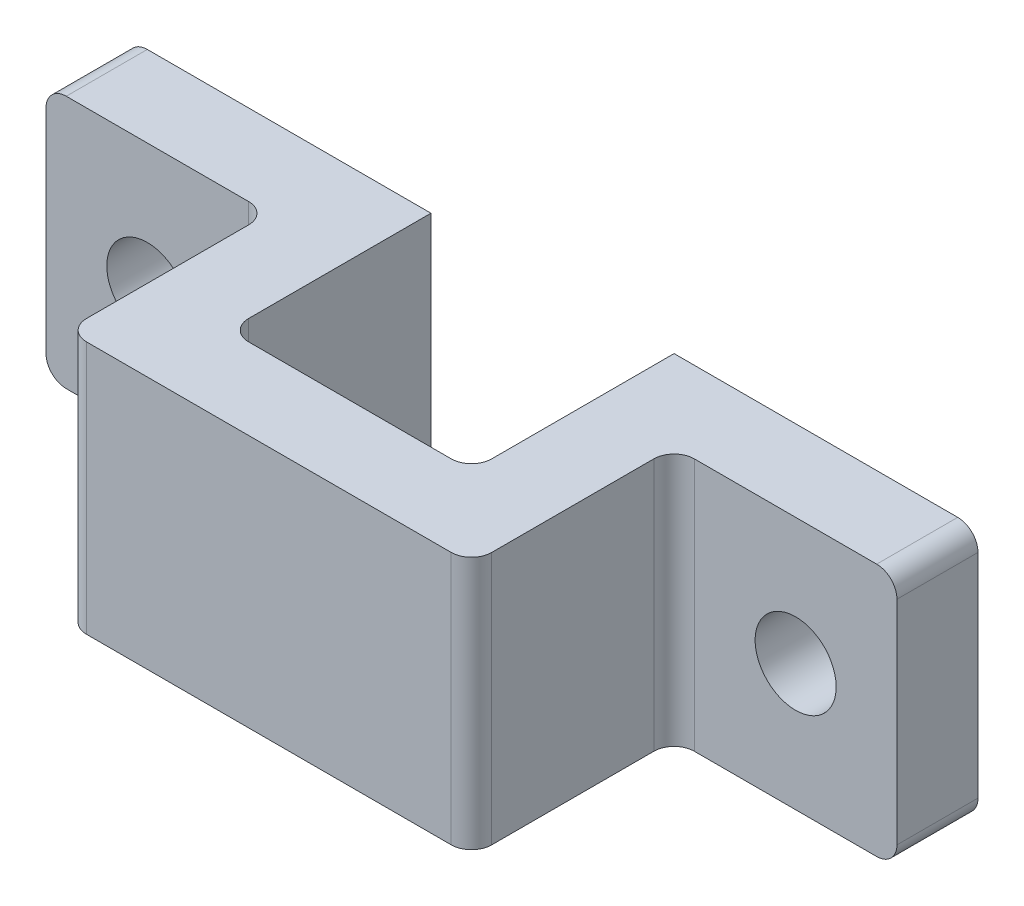
ISO-10303-21;
HEADER;
FILE_DESCRIPTION(('STEP AP214'),'2;1');
FILE_NAME('part.step','',(''),(''),'','','');
FILE_SCHEMA(('AUTOMOTIVE_DESIGN { 1 0 10303 214 1 1 1 1 }'));
ENDSEC;
DATA;
#1=APPLICATION_CONTEXT('core data for automotive mechanical design processes');
#2=APPLICATION_PROTOCOL_DEFINITION('international standard','automotive_design',2000,#1);
#3=PRODUCT_CONTEXT('',#1,'mechanical');
#4=PRODUCT('Part','Part','',(#3));
#5=PRODUCT_RELATED_PRODUCT_CATEGORY('part','',(#4));
#6=PRODUCT_DEFINITION_FORMATION('','',#4);
#7=PRODUCT_DEFINITION_CONTEXT('part definition',#1,'design');
#8=PRODUCT_DEFINITION('design','',#6,#7);
#9=PRODUCT_DEFINITION_SHAPE('','',#8);
#10=(LENGTH_UNIT() NAMED_UNIT(*) SI_UNIT(.MILLI.,.METRE.));
#11=(NAMED_UNIT(*) PLANE_ANGLE_UNIT() SI_UNIT($,.RADIAN.));
#12=(NAMED_UNIT(*) SI_UNIT($,.STERADIAN.) SOLID_ANGLE_UNIT());
#13=UNCERTAINTY_MEASURE_WITH_UNIT(LENGTH_MEASURE(1.E-05),#10,'distance_accuracy_value','');
#14=(GEOMETRIC_REPRESENTATION_CONTEXT(3) GLOBAL_UNCERTAINTY_ASSIGNED_CONTEXT((#13)) GLOBAL_UNIT_ASSIGNED_CONTEXT((#10,
#11,#12)) REPRESENTATION_CONTEXT('',''));
#15=CARTESIAN_POINT('',(0.,0.,0.));
#16=DIRECTION('',(0.,0.,1.));
#17=DIRECTION('',(1.,0.,0.));
#18=AXIS2_PLACEMENT_3D('',#15,#16,#17);
#19=CARTESIAN_POINT('',(0.,0.,0.));
#20=DIRECTION('',(0.,0.,1.));
#21=DIRECTION('',(1.,0.,0.));
#22=AXIS2_PLACEMENT_3D('',#19,#20,#21);
#23=PLANE('',#22);
#24=CARTESIAN_POINT('',(-16.,0.,0.));
#25=DIRECTION('',(0.,0.,1.));
#26=DIRECTION('',(-1.,0.,0.));
#27=AXIS2_PLACEMENT_3D('',#24,#25,#26);
#28=CIRCLE('',#27,2.);
#29=CARTESIAN_POINT('',(-14.,0.,0.));
#30=VERTEX_POINT('',#29);
#31=EDGE_CURVE('E426',#30,#30,#28,.T.);
#32=ORIENTED_EDGE('',*,*,#31,.T.);
#33=EDGE_LOOP('',(#32));
#34=FACE_BOUND('',#33,.T.);
#35=CARTESIAN_POINT('',(-20.,5.25,0.));
#36=DIRECTION('',(0.,0.,1.));
#37=DIRECTION('',(-0.707106781186548,0.707106781186548,0.));
#38=AXIS2_PLACEMENT_3D('',#35,#36,#37);
#39=CIRCLE('',#38,1.);
#40=CARTESIAN_POINT('',(-20.,6.25,0.));
#41=VERTEX_POINT('',#40);
#42=CARTESIAN_POINT('',(-21.,5.25,0.));
#43=VERTEX_POINT('',#42);
#44=EDGE_CURVE('E460',#41,#43,#39,.T.);
#45=ORIENTED_EDGE('',*,*,#44,.F.);
#46=DIRECTION('',(1.,0.,0.));
#47=VECTOR('',#46,1.);
#48=CARTESIAN_POINT('',(-21.,6.25,0.));
#49=LINE('',#48,#47);
#50=CARTESIAN_POINT('',(-6.,6.25,0.));
#51=VERTEX_POINT('',#50);
#52=EDGE_CURVE('E350',#41,#51,#49,.T.);
#53=ORIENTED_EDGE('',*,*,#52,.T.);
#54=DIRECTION('',(0.,-1.,0.));
#55=VECTOR('',#54,1.);
#56=CARTESIAN_POINT('',(-6.,-3.125,0.));
#57=LINE('',#56,#55);
#58=CARTESIAN_POINT('',(-6.,-6.25,0.));
#59=VERTEX_POINT('',#58);
#60=EDGE_CURVE('E320',#51,#59,#57,.T.);
#61=ORIENTED_EDGE('',*,*,#60,.T.);
#62=DIRECTION('',(-1.,0.,0.));
#63=VECTOR('',#62,1.);
#64=CARTESIAN_POINT('',(21.,-6.25,0.));
#65=LINE('',#64,#63);
#66=CARTESIAN_POINT('',(-20.,-6.25,0.));
#67=VERTEX_POINT('',#66);
#68=EDGE_CURVE('E484',#59,#67,#65,.T.);
#69=ORIENTED_EDGE('',*,*,#68,.T.);
#70=CARTESIAN_POINT('',(-20.,-5.25,0.));
#71=DIRECTION('',(0.,0.,1.));
#72=DIRECTION('',(-0.707106781186548,-0.707106781186548,0.));
#73=AXIS2_PLACEMENT_3D('',#70,#71,#72);
#74=CIRCLE('',#73,1.);
#75=CARTESIAN_POINT('',(-21.,-5.25,0.));
#76=VERTEX_POINT('',#75);
#77=EDGE_CURVE('E329',#76,#67,#74,.T.);
#78=ORIENTED_EDGE('',*,*,#77,.F.);
#79=DIRECTION('',(0.,1.,0.));
#80=VECTOR('',#79,1.);
#81=CARTESIAN_POINT('',(-21.,-6.25,0.));
#82=LINE('',#81,#80);
#83=EDGE_CURVE('E12',#76,#43,#82,.T.);
#84=ORIENTED_EDGE('',*,*,#83,.T.);
#85=EDGE_LOOP('',(#45,#53,#61,#69,#78,#84));
#86=FACE_BOUND('',#85,.T.);
#87=ADVANCED_FACE('F19',(#34,#86),#23,.F.);
#88=CARTESIAN_POINT('',(-21.,6.25,0.));
#89=DIRECTION('',(-1.,0.,0.));
#90=DIRECTION('',(0.,0.,1.));
#91=AXIS2_PLACEMENT_3D('',#88,#89,#90);
#92=PLANE('',#91);
#93=DIRECTION('',(0.,0.,1.));
#94=VECTOR('',#93,1.);
#95=CARTESIAN_POINT('',(-21.,5.25,0.));
#96=LINE('',#95,#94);
#97=CARTESIAN_POINT('',(-21.,5.25,4.));
#98=VERTEX_POINT('',#97);
#99=EDGE_CURVE('E466',#43,#98,#96,.T.);
#100=ORIENTED_EDGE('',*,*,#99,.F.);
#101=ORIENTED_EDGE('',*,*,#83,.F.);
#102=DIRECTION('',(0.,0.,-1.));
#103=VECTOR('',#102,1.);
#104=CARTESIAN_POINT('',(-21.,-5.25,0.));
#105=LINE('',#104,#103);
#106=CARTESIAN_POINT('',(-21.,-5.25,4.));
#107=VERTEX_POINT('',#106);
#108=EDGE_CURVE('E325',#107,#76,#105,.T.);
#109=ORIENTED_EDGE('',*,*,#108,.F.);
#110=DIRECTION('',(0.,-1.,0.));
#111=VECTOR('',#110,1.);
#112=CARTESIAN_POINT('',(-21.,-6.25,4.));
#113=LINE('',#112,#111);
#114=EDGE_CURVE('E476',#98,#107,#113,.T.);
#115=ORIENTED_EDGE('',*,*,#114,.F.);
#116=EDGE_LOOP('',(#100,#101,#109,#115));
#117=FACE_BOUND('',#116,.T.);
#118=ADVANCED_FACE('F703',(#117),#92,.T.);
#119=CARTESIAN_POINT('',(21.,-6.25,0.));
#120=DIRECTION('',(1.,0.,0.));
#121=DIRECTION('',(0.,1.,0.));
#122=AXIS2_PLACEMENT_3D('',#119,#120,#121);
#123=PLANE('',#122);
#124=DIRECTION('',(0.,0.,-1.));
#125=VECTOR('',#124,1.);
#126=CARTESIAN_POINT('',(21.,5.25,0.));
#127=LINE('',#126,#125);
#128=CARTESIAN_POINT('',(21.,5.25,4.));
#129=VERTEX_POINT('',#128);
#130=CARTESIAN_POINT('',(21.,5.25,0.));
#131=VERTEX_POINT('',#130);
#132=EDGE_CURVE('E291',#129,#131,#127,.T.);
#133=ORIENTED_EDGE('',*,*,#132,.F.);
#134=DIRECTION('',(0.,1.,0.));
#135=VECTOR('',#134,1.);
#136=CARTESIAN_POINT('',(21.,6.25,4.));
#137=LINE('',#136,#135);
#138=CARTESIAN_POINT('',(21.,-5.25,4.));
#139=VERTEX_POINT('',#138);
#140=EDGE_CURVE('E30',#139,#129,#137,.T.);
#141=ORIENTED_EDGE('',*,*,#140,.F.);
#142=DIRECTION('',(0.,0.,1.));
#143=VECTOR('',#142,1.);
#144=CARTESIAN_POINT('',(21.,-5.25,0.));
#145=LINE('',#144,#143);
#146=CARTESIAN_POINT('',(21.,-5.25,0.));
#147=VERTEX_POINT('',#146);
#148=EDGE_CURVE('E23',#147,#139,#145,.T.);
#149=ORIENTED_EDGE('',*,*,#148,.F.);
#150=DIRECTION('',(0.,-1.,0.));
#151=VECTOR('',#150,1.);
#152=CARTESIAN_POINT('',(21.,6.25,0.));
#153=LINE('',#152,#151);
#154=EDGE_CURVE('E212',#131,#147,#153,.T.);
#155=ORIENTED_EDGE('',*,*,#154,.F.);
#156=EDGE_LOOP('',(#133,#141,#149,#155));
#157=FACE_BOUND('',#156,.T.);
#158=ADVANCED_FACE('F725',(#157),#123,.T.);
#159=CARTESIAN_POINT('',(0.,0.,4.));
#160=DIRECTION('',(0.,0.,1.));
#161=DIRECTION('',(1.,0.,0.));
#162=AXIS2_PLACEMENT_3D('',#159,#160,#161);
#163=PLANE('',#162);
#164=CARTESIAN_POINT('',(16.0000003129244,0.,4.));
#165=DIRECTION('',(0.,0.,-1.));
#166=DIRECTION('',(-1.,0.,0.));
#167=AXIS2_PLACEMENT_3D('',#164,#165,#166);
#168=CIRCLE('',#167,2.);
#169=CARTESIAN_POINT('',(18.0000003129244,0.,4.));
#170=VERTEX_POINT('',#169);
#171=EDGE_CURVE('E315',#170,#170,#168,.T.);
#172=ORIENTED_EDGE('',*,*,#171,.T.);
#173=EDGE_LOOP('',(#172));
#174=FACE_BOUND('',#173,.T.);
#175=CARTESIAN_POINT('',(20.,5.25,4.));
#176=DIRECTION('',(0.,0.,-1.));
#177=DIRECTION('',(0.707106781186548,0.707106781186548,0.));
#178=AXIS2_PLACEMENT_3D('',#175,#176,#177);
#179=CIRCLE('',#178,1.);
#180=CARTESIAN_POINT('',(20.,6.25,4.));
#181=VERTEX_POINT('',#180);
#182=EDGE_CURVE('E210',#181,#129,#179,.T.);
#183=ORIENTED_EDGE('',*,*,#182,.F.);
#184=DIRECTION('',(-1.,0.,0.));
#185=VECTOR('',#184,1.);
#186=CARTESIAN_POINT('',(-21.,6.25,4.));
#187=LINE('',#186,#185);
#188=CARTESIAN_POINT('',(11.,6.25,4.));
#189=VERTEX_POINT('',#188);
#190=EDGE_CURVE('E151',#181,#189,#187,.T.);
#191=ORIENTED_EDGE('',*,*,#190,.T.);
#192=DIRECTION('',(0.,1.,0.));
#193=VECTOR('',#192,1.);
#194=CARTESIAN_POINT('',(11.,-3.125,4.));
#195=LINE('',#194,#193);
#196=CARTESIAN_POINT('',(11.,-6.25,4.));
#197=VERTEX_POINT('',#196);
#198=EDGE_CURVE('E194',#197,#189,#195,.T.);
#199=ORIENTED_EDGE('',*,*,#198,.F.);
#200=DIRECTION('',(1.,0.,0.));
#201=VECTOR('',#200,1.);
#202=CARTESIAN_POINT('',(21.,-6.25,4.));
#203=LINE('',#202,#201);
#204=CARTESIAN_POINT('',(20.,-6.25,4.));
#205=VERTEX_POINT('',#204);
#206=EDGE_CURVE('E259',#197,#205,#203,.T.);
#207=ORIENTED_EDGE('',*,*,#206,.T.);
#208=CARTESIAN_POINT('',(20.,-5.25,4.));
#209=DIRECTION('',(0.,0.,-1.));
#210=DIRECTION('',(0.707106781186548,-0.707106781186548,0.));
#211=AXIS2_PLACEMENT_3D('',#208,#209,#210);
#212=CIRCLE('',#211,1.);
#213=EDGE_CURVE('E379',#139,#205,#212,.T.);
#214=ORIENTED_EDGE('',*,*,#213,.F.);
#215=ORIENTED_EDGE('',*,*,#140,.T.);
#216=EDGE_LOOP('',(#183,#191,#199,#207,#214,#215));
#217=FACE_BOUND('',#216,.T.);
#218=ADVANCED_FACE('F208',(#174,#217),#163,.T.);
#219=CARTESIAN_POINT('',(-5.,-6.25,9.));
#220=DIRECTION('',(0.,1.,0.));
#221=DIRECTION('',(0.,0.,1.));
#222=AXIS2_PLACEMENT_3D('',#219,#220,#221);
#223=CYLINDRICAL_SURFACE('',#222,1.);
#224=CARTESIAN_POINT('',(-5.,6.25,9.));
#225=DIRECTION('',(0.,-1.,0.));
#226=DIRECTION('',(0.,0.,1.));
#227=AXIS2_PLACEMENT_3D('',#224,#225,#226);
#228=CIRCLE('',#227,1.);
#229=CARTESIAN_POINT('',(-5.,6.25,10.));
#230=VERTEX_POINT('',#229);
#231=CARTESIAN_POINT('',(-6.,6.25,9.));
#232=VERTEX_POINT('',#231);
#233=EDGE_CURVE('E285',#230,#232,#228,.T.);
#234=ORIENTED_EDGE('',*,*,#233,.F.);
#235=DIRECTION('',(0.,1.,0.));
#236=VECTOR('',#235,1.);
#237=CARTESIAN_POINT('',(-5.,-6.25,10.));
#238=LINE('',#237,#236);
#239=CARTESIAN_POINT('',(-5.,-6.25,10.));
#240=VERTEX_POINT('',#239);
#241=EDGE_CURVE('E264',#240,#230,#238,.T.);
#242=ORIENTED_EDGE('',*,*,#241,.F.);
#243=CARTESIAN_POINT('',(-5.,-6.25,9.));
#244=DIRECTION('',(0.,1.,0.));
#245=DIRECTION('',(0.,0.,1.));
#246=AXIS2_PLACEMENT_3D('',#243,#244,#245);
#247=CIRCLE('',#246,1.);
#248=CARTESIAN_POINT('',(-6.,-6.25,9.));
#249=VERTEX_POINT('',#248);
#250=EDGE_CURVE('E483',#249,#240,#247,.T.);
#251=ORIENTED_EDGE('',*,*,#250,.F.);
#252=DIRECTION('',(0.,1.,0.));
#253=VECTOR('',#252,1.);
#254=CARTESIAN_POINT('',(-6.,-6.25,9.));
#255=LINE('',#254,#253);
#256=EDGE_CURVE('E316',#249,#232,#255,.T.);
#257=ORIENTED_EDGE('',*,*,#256,.T.);
#258=EDGE_LOOP('',(#234,#242,#251,#257));
#259=FACE_BOUND('',#258,.T.);
#260=ADVANCED_FACE('F728',(#259),#223,.F.);
#261=CARTESIAN_POINT('',(-5.,-6.25,10.));
#262=DIRECTION('',(0.,0.,1.));
#263=DIRECTION('',(1.,0.,0.));
#264=AXIS2_PLACEMENT_3D('',#261,#262,#263);
#265=PLANE('',#264);
#266=DIRECTION('',(-1.,0.,0.));
#267=VECTOR('',#266,1.);
#268=CARTESIAN_POINT('',(8.,6.25,10.));
#269=LINE('',#268,#267);
#270=CARTESIAN_POINT('',(5.,6.25,10.));
#271=VERTEX_POINT('',#270);
#272=EDGE_CURVE('E290',#271,#230,#269,.T.);
#273=ORIENTED_EDGE('',*,*,#272,.F.);
#274=DIRECTION('',(0.,1.,0.));
#275=VECTOR('',#274,1.);
#276=CARTESIAN_POINT('',(5.,-6.25,10.));
#277=LINE('',#276,#275);
#278=CARTESIAN_POINT('',(5.,-6.25,10.));
#279=VERTEX_POINT('',#278);
#280=EDGE_CURVE('E399',#279,#271,#277,.T.);
#281=ORIENTED_EDGE('',*,*,#280,.F.);
#282=DIRECTION('',(1.,0.,0.));
#283=VECTOR('',#282,1.);
#284=CARTESIAN_POINT('',(-13.,-6.25,10.));
#285=LINE('',#284,#283);
#286=EDGE_CURVE('E251',#240,#279,#285,.T.);
#287=ORIENTED_EDGE('',*,*,#286,.F.);
#288=ORIENTED_EDGE('',*,*,#241,.T.);
#289=EDGE_LOOP('',(#273,#281,#287,#288));
#290=FACE_BOUND('',#289,.T.);
#291=ADVANCED_FACE('F731',(#290),#265,.F.);
#292=CARTESIAN_POINT('',(5.,-6.25,9.));
#293=DIRECTION('',(0.,1.,0.));
#294=DIRECTION('',(1.,0.,0.));
#295=AXIS2_PLACEMENT_3D('',#292,#293,#294);
#296=CYLINDRICAL_SURFACE('',#295,1.);
#297=CARTESIAN_POINT('',(5.,6.25,9.));
#298=DIRECTION('',(0.,-1.,0.));
#299=DIRECTION('',(1.,0.,0.));
#300=AXIS2_PLACEMENT_3D('',#297,#298,#299);
#301=CIRCLE('',#300,1.);
#302=CARTESIAN_POINT('',(6.,6.25,9.));
#303=VERTEX_POINT('',#302);
#304=EDGE_CURVE('E302',#303,#271,#301,.T.);
#305=ORIENTED_EDGE('',*,*,#304,.F.);
#306=DIRECTION('',(0.,1.,0.));
#307=VECTOR('',#306,1.);
#308=CARTESIAN_POINT('',(6.,-6.25,9.));
#309=LINE('',#308,#307);
#310=CARTESIAN_POINT('',(6.,-6.25,9.));
#311=VERTEX_POINT('',#310);
#312=EDGE_CURVE('E271',#311,#303,#309,.T.);
#313=ORIENTED_EDGE('',*,*,#312,.F.);
#314=CARTESIAN_POINT('',(5.,-6.25,9.));
#315=DIRECTION('',(0.,1.,0.));
#316=DIRECTION('',(1.,0.,0.));
#317=AXIS2_PLACEMENT_3D('',#314,#315,#316);
#318=CIRCLE('',#317,1.);
#319=EDGE_CURVE('E247',#279,#311,#318,.T.);
#320=ORIENTED_EDGE('',*,*,#319,.F.);
#321=ORIENTED_EDGE('',*,*,#280,.T.);
#322=EDGE_LOOP('',(#305,#313,#320,#321));
#323=FACE_BOUND('',#322,.T.);
#324=ADVANCED_FACE('F770',(#323),#296,.F.);
#325=CARTESIAN_POINT('',(6.,-6.25,9.));
#326=DIRECTION('',(1.,0.,0.));
#327=DIRECTION('',(0.,1.,0.));
#328=AXIS2_PLACEMENT_3D('',#325,#326,#327);
#329=PLANE('',#328);
#330=DIRECTION('',(0.,0.,1.));
#331=VECTOR('',#330,1.);
#332=CARTESIAN_POINT('',(6.,6.25,4.5));
#333=LINE('',#332,#331);
#334=CARTESIAN_POINT('',(6.,6.25,0.));
#335=VERTEX_POINT('',#334);
#336=EDGE_CURVE('E228',#335,#303,#333,.T.);
#337=ORIENTED_EDGE('',*,*,#336,.F.);
#338=DIRECTION('',(0.,1.,0.));
#339=VECTOR('',#338,1.);
#340=CARTESIAN_POINT('',(6.,-3.125,0.));
#341=LINE('',#340,#339);
#342=CARTESIAN_POINT('',(6.,-6.25,0.));
#343=VERTEX_POINT('',#342);
#344=EDGE_CURVE('E419',#343,#335,#341,.T.);
#345=ORIENTED_EDGE('',*,*,#344,.F.);
#346=DIRECTION('',(0.,0.,-1.));
#347=VECTOR('',#346,1.);
#348=CARTESIAN_POINT('',(6.,-6.25,4.5));
#349=LINE('',#348,#347);
#350=EDGE_CURVE('E250',#311,#343,#349,.T.);
#351=ORIENTED_EDGE('',*,*,#350,.F.);
#352=ORIENTED_EDGE('',*,*,#312,.T.);
#353=EDGE_LOOP('',(#337,#345,#351,#352));
#354=FACE_BOUND('',#353,.T.);
#355=ADVANCED_FACE('F757',(#354),#329,.F.);
#356=CARTESIAN_POINT('',(-6.,-6.25,0.));
#357=DIRECTION('',(-1.,0.,0.));
#358=DIRECTION('',(0.,0.,1.));
#359=AXIS2_PLACEMENT_3D('',#356,#357,#358);
#360=PLANE('',#359);
#361=DIRECTION('',(0.,0.,-1.));
#362=VECTOR('',#361,1.);
#363=CARTESIAN_POINT('',(-6.,6.25,0.));
#364=LINE('',#363,#362);
#365=EDGE_CURVE('E244',#232,#51,#364,.T.);
#366=ORIENTED_EDGE('',*,*,#365,.F.);
#367=ORIENTED_EDGE('',*,*,#256,.F.);
#368=DIRECTION('',(0.,0.,1.));
#369=VECTOR('',#368,1.);
#370=CARTESIAN_POINT('',(-6.,-6.25,0.));
#371=LINE('',#370,#369);
#372=EDGE_CURVE('E480',#59,#249,#371,.T.);
#373=ORIENTED_EDGE('',*,*,#372,.F.);
#374=ORIENTED_EDGE('',*,*,#60,.F.);
#375=EDGE_LOOP('',(#366,#367,#373,#374));
#376=FACE_BOUND('',#375,.T.);
#377=ADVANCED_FACE('F754',(#376),#360,.F.);
#378=CARTESIAN_POINT('',(0.,0.,14.));
#379=DIRECTION('',(0.,0.,1.));
#380=DIRECTION('',(1.,0.,0.));
#381=AXIS2_PLACEMENT_3D('',#378,#379,#380);
#382=PLANE('',#381);
#383=DIRECTION('',(0.,-1.,0.));
#384=VECTOR('',#383,1.);
#385=CARTESIAN_POINT('',(9.,-3.125,14.));
#386=LINE('',#385,#384);
#387=CARTESIAN_POINT('',(9.,6.25,14.));
#388=VERTEX_POINT('',#387);
#389=CARTESIAN_POINT('',(9.,-6.25,14.));
#390=VERTEX_POINT('',#389);
#391=EDGE_CURVE('E265',#388,#390,#386,.T.);
#392=ORIENTED_EDGE('',*,*,#391,.F.);
#393=DIRECTION('',(-1.,0.,0.));
#394=VECTOR('',#393,1.);
#395=CARTESIAN_POINT('',(-10.,6.25,14.));
#396=LINE('',#395,#394);
#397=CARTESIAN_POINT('',(-9.,6.25,14.));
#398=VERTEX_POINT('',#397);
#399=EDGE_CURVE('E243',#388,#398,#396,.T.);
#400=ORIENTED_EDGE('',*,*,#399,.T.);
#401=DIRECTION('',(0.,1.,0.));
#402=VECTOR('',#401,1.);
#403=CARTESIAN_POINT('',(-9.,3.125,14.));
#404=LINE('',#403,#402);
#405=CARTESIAN_POINT('',(-9.,-6.25,14.));
#406=VERTEX_POINT('',#405);
#407=EDGE_CURVE('E321',#406,#398,#404,.T.);
#408=ORIENTED_EDGE('',*,*,#407,.F.);
#409=DIRECTION('',(1.,0.,0.));
#410=VECTOR('',#409,1.);
#411=CARTESIAN_POINT('',(10.,-6.25,14.));
#412=LINE('',#411,#410);
#413=EDGE_CURVE('E253',#406,#390,#412,.T.);
#414=ORIENTED_EDGE('',*,*,#413,.T.);
#415=EDGE_LOOP('',(#392,#400,#408,#414));
#416=FACE_BOUND('',#415,.T.);
#417=ADVANCED_FACE('F756',(#416),#382,.T.);
#418=CARTESIAN_POINT('',(-9.,3.125,13.));
#419=DIRECTION('',(0.,-1.,0.));
#420=DIRECTION('',(-0.707106781186548,0.,0.707106781186548));
#421=AXIS2_PLACEMENT_3D('',#418,#419,#420);
#422=CYLINDRICAL_SURFACE('',#421,1.);
#423=CARTESIAN_POINT('',(-9.,-6.25,13.));
#424=DIRECTION('',(0.,1.,0.));
#425=DIRECTION('',(-0.707106781186548,0.,0.707106781186548));
#426=AXIS2_PLACEMENT_3D('',#423,#424,#425);
#427=CIRCLE('',#426,1.);
#428=CARTESIAN_POINT('',(-10.,-6.25,13.));
#429=VERTEX_POINT('',#428);
#430=EDGE_CURVE('E257',#429,#406,#427,.T.);
#431=ORIENTED_EDGE('',*,*,#430,.T.);
#432=ORIENTED_EDGE('',*,*,#407,.T.);
#433=CARTESIAN_POINT('',(-9.,6.25,13.));
#434=DIRECTION('',(0.,-1.,0.));
#435=DIRECTION('',(-0.707106781186548,0.,0.707106781186548));
#436=AXIS2_PLACEMENT_3D('',#433,#434,#435);
#437=CIRCLE('',#436,1.);
#438=CARTESIAN_POINT('',(-10.,6.25,13.));
#439=VERTEX_POINT('',#438);
#440=EDGE_CURVE('E365',#398,#439,#437,.T.);
#441=ORIENTED_EDGE('',*,*,#440,.T.);
#442=DIRECTION('',(0.,-1.,0.));
#443=VECTOR('',#442,1.);
#444=CARTESIAN_POINT('',(-10.,3.125,13.));
#445=LINE('',#444,#443);
#446=EDGE_CURVE('E284',#439,#429,#445,.T.);
#447=ORIENTED_EDGE('',*,*,#446,.T.);
#448=EDGE_LOOP('',(#431,#432,#441,#447));
#449=FACE_BOUND('',#448,.T.);
#450=ADVANCED_FACE('F519',(#449),#422,.T.);
#451=CARTESIAN_POINT('',(-20.,-5.25,0.));
#452=DIRECTION('',(0.,0.,1.));
#453=DIRECTION('',(-0.707106781186548,-0.707106781186548,0.));
#454=AXIS2_PLACEMENT_3D('',#451,#452,#453);
#455=CYLINDRICAL_SURFACE('',#454,1.);
#456=CARTESIAN_POINT('',(-20.,-5.25,4.));
#457=DIRECTION('',(0.,0.,-1.));
#458=DIRECTION('',(-0.707106781186548,-0.707106781186548,0.));
#459=AXIS2_PLACEMENT_3D('',#456,#457,#458);
#460=CIRCLE('',#459,1.);
#461=CARTESIAN_POINT('',(-20.,-6.25,4.));
#462=VERTEX_POINT('',#461);
#463=EDGE_CURVE('E308',#462,#107,#460,.T.);
#464=ORIENTED_EDGE('',*,*,#463,.T.);
#465=ORIENTED_EDGE('',*,*,#108,.T.);
#466=ORIENTED_EDGE('',*,*,#77,.T.);
#467=DIRECTION('',(0.,0.,1.));
#468=VECTOR('',#467,1.);
#469=CARTESIAN_POINT('',(-20.,-6.25,0.));
#470=LINE('',#469,#468);
#471=EDGE_CURVE('E815',#67,#462,#470,.T.);
#472=ORIENTED_EDGE('',*,*,#471,.T.);
#473=EDGE_LOOP('',(#464,#465,#466,#472));
#474=FACE_BOUND('',#473,.T.);
#475=ADVANCED_FACE('F21',(#474),#455,.T.);
#476=CARTESIAN_POINT('',(0.,0.,4.));
#477=DIRECTION('',(0.,0.,1.));
#478=DIRECTION('',(1.,0.,0.));
#479=AXIS2_PLACEMENT_3D('',#476,#477,#478);
#480=PLANE('',#479);
#481=CARTESIAN_POINT('',(-16.,0.,4.));
#482=DIRECTION('',(0.,0.,-1.));
#483=DIRECTION('',(-1.,0.,0.));
#484=AXIS2_PLACEMENT_3D('',#481,#482,#483);
#485=CIRCLE('',#484,2.);
#486=CARTESIAN_POINT('',(-14.,0.,4.));
#487=VERTEX_POINT('',#486);
#488=EDGE_CURVE('E427',#487,#487,#485,.T.);
#489=ORIENTED_EDGE('',*,*,#488,.T.);
#490=EDGE_LOOP('',(#489));
#491=FACE_BOUND('',#490,.T.);
#492=DIRECTION('',(0.,-1.,0.));
#493=VECTOR('',#492,1.);
#494=CARTESIAN_POINT('',(-11.,3.125,4.));
#495=LINE('',#494,#493);
#496=CARTESIAN_POINT('',(-11.,6.25,4.));
#497=VERTEX_POINT('',#496);
#498=CARTESIAN_POINT('',(-11.,-6.25,4.));
#499=VERTEX_POINT('',#498);
#500=EDGE_CURVE('E280',#497,#499,#495,.T.);
#501=ORIENTED_EDGE('',*,*,#500,.F.);
#502=DIRECTION('',(-1.,0.,0.));
#503=VECTOR('',#502,1.);
#504=CARTESIAN_POINT('',(-21.,6.25,4.));
#505=LINE('',#504,#503);
#506=CARTESIAN_POINT('',(-20.,6.25,4.));
#507=VERTEX_POINT('',#506);
#508=EDGE_CURVE('E333',#497,#507,#505,.T.);
#509=ORIENTED_EDGE('',*,*,#508,.T.);
#510=CARTESIAN_POINT('',(-20.,5.25,4.));
#511=DIRECTION('',(0.,0.,-1.));
#512=DIRECTION('',(-0.707106781186548,0.707106781186548,0.));
#513=AXIS2_PLACEMENT_3D('',#510,#511,#512);
#514=CIRCLE('',#513,1.);
#515=EDGE_CURVE('E324',#98,#507,#514,.T.);
#516=ORIENTED_EDGE('',*,*,#515,.F.);
#517=ORIENTED_EDGE('',*,*,#114,.T.);
#518=ORIENTED_EDGE('',*,*,#463,.F.);
#519=DIRECTION('',(1.,0.,0.));
#520=VECTOR('',#519,1.);
#521=CARTESIAN_POINT('',(21.,-6.25,4.));
#522=LINE('',#521,#520);
#523=EDGE_CURVE('E231',#462,#499,#522,.T.);
#524=ORIENTED_EDGE('',*,*,#523,.T.);
#525=EDGE_LOOP('',(#501,#509,#516,#517,#518,#524));
#526=FACE_BOUND('',#525,.T.);
#527=ADVANCED_FACE('F707',(#491,#526),#480,.T.);
#528=CARTESIAN_POINT('',(-20.,5.25,0.));
#529=DIRECTION('',(0.,0.,1.));
#530=DIRECTION('',(-0.707106781186548,0.707106781186548,0.));
#531=AXIS2_PLACEMENT_3D('',#528,#529,#530);
#532=CYLINDRICAL_SURFACE('',#531,1.);
#533=ORIENTED_EDGE('',*,*,#515,.T.);
#534=DIRECTION('',(0.,0.,-1.));
#535=VECTOR('',#534,1.);
#536=CARTESIAN_POINT('',(-20.,6.25,0.));
#537=LINE('',#536,#535);
#538=EDGE_CURVE('E337',#507,#41,#537,.T.);
#539=ORIENTED_EDGE('',*,*,#538,.T.);
#540=ORIENTED_EDGE('',*,*,#44,.T.);
#541=ORIENTED_EDGE('',*,*,#99,.T.);
#542=EDGE_LOOP('',(#533,#539,#540,#541));
#543=FACE_BOUND('',#542,.T.);
#544=ADVANCED_FACE('F705',(#543),#532,.T.);
#545=CARTESIAN_POINT('',(-10.,6.25,4.));
#546=DIRECTION('',(-1.,0.,0.));
#547=DIRECTION('',(0.,0.,1.));
#548=AXIS2_PLACEMENT_3D('',#545,#546,#547);
#549=PLANE('',#548);
#550=DIRECTION('',(0.,1.,0.));
#551=VECTOR('',#550,1.);
#552=CARTESIAN_POINT('',(-10.,3.125,5.));
#553=LINE('',#552,#551);
#554=CARTESIAN_POINT('',(-10.,-6.25,5.));
#555=VERTEX_POINT('',#554);
#556=CARTESIAN_POINT('',(-10.,6.25,5.));
#557=VERTEX_POINT('',#556);
#558=EDGE_CURVE('E270',#555,#557,#553,.T.);
#559=ORIENTED_EDGE('',*,*,#558,.F.);
#560=DIRECTION('',(0.,0.,1.));
#561=VECTOR('',#560,1.);
#562=CARTESIAN_POINT('',(-10.,-6.25,4.));
#563=LINE('',#562,#561);
#564=EDGE_CURVE('E370',#555,#429,#563,.T.);
#565=ORIENTED_EDGE('',*,*,#564,.T.);
#566=ORIENTED_EDGE('',*,*,#446,.F.);
#567=DIRECTION('',(0.,0.,1.));
#568=VECTOR('',#567,1.);
#569=CARTESIAN_POINT('',(-10.,6.25,4.));
#570=LINE('',#569,#568);
#571=EDGE_CURVE('E347',#557,#439,#570,.T.);
#572=ORIENTED_EDGE('',*,*,#571,.F.);
#573=EDGE_LOOP('',(#559,#565,#566,#572));
#574=FACE_BOUND('',#573,.T.);
#575=ADVANCED_FACE('F527',(#574),#549,.T.);
#576=CARTESIAN_POINT('',(-11.,3.125,5.));
#577=DIRECTION('',(0.,1.,0.));
#578=DIRECTION('',(0.707106781186548,0.,-0.707106781186547));
#579=AXIS2_PLACEMENT_3D('',#576,#577,#578);
#580=CYLINDRICAL_SURFACE('',#579,1.);
#581=CARTESIAN_POINT('',(-11.,-6.25,5.));
#582=DIRECTION('',(0.,-1.,0.));
#583=DIRECTION('',(0.707106781186548,0.,-0.707106781186547));
#584=AXIS2_PLACEMENT_3D('',#581,#582,#583);
#585=CIRCLE('',#584,1.);
#586=EDGE_CURVE('E374',#499,#555,#585,.T.);
#587=ORIENTED_EDGE('',*,*,#586,.T.);
#588=ORIENTED_EDGE('',*,*,#558,.T.);
#589=CARTESIAN_POINT('',(-11.,6.25,5.));
#590=DIRECTION('',(0.,1.,0.));
#591=DIRECTION('',(0.707106781186548,0.,-0.707106781186547));
#592=AXIS2_PLACEMENT_3D('',#589,#590,#591);
#593=CIRCLE('',#592,1.);
#594=EDGE_CURVE('E336',#557,#497,#593,.T.);
#595=ORIENTED_EDGE('',*,*,#594,.T.);
#596=ORIENTED_EDGE('',*,*,#500,.T.);
#597=EDGE_LOOP('',(#587,#588,#595,#596));
#598=FACE_BOUND('',#597,.T.);
#599=ADVANCED_FACE('F714',(#598),#580,.F.);
#600=CARTESIAN_POINT('',(9.,-3.125,13.));
#601=DIRECTION('',(0.,1.,0.));
#602=DIRECTION('',(0.707106781186548,0.,0.707106781186548));
#603=AXIS2_PLACEMENT_3D('',#600,#601,#602);
#604=CYLINDRICAL_SURFACE('',#603,1.);
#605=CARTESIAN_POINT('',(9.,6.25,13.));
#606=DIRECTION('',(0.,-1.,0.));
#607=DIRECTION('',(0.707106781186548,0.,0.707106781186548));
#608=AXIS2_PLACEMENT_3D('',#605,#606,#607);
#609=CIRCLE('',#608,1.);
#610=CARTESIAN_POINT('',(10.,6.25,13.));
#611=VERTEX_POINT('',#610);
#612=EDGE_CURVE('E223',#611,#388,#609,.T.);
#613=ORIENTED_EDGE('',*,*,#612,.T.);
#614=ORIENTED_EDGE('',*,*,#391,.T.);
#615=CARTESIAN_POINT('',(9.,-6.25,13.));
#616=DIRECTION('',(0.,1.,0.));
#617=DIRECTION('',(0.707106781186548,0.,0.707106781186548));
#618=AXIS2_PLACEMENT_3D('',#615,#616,#617);
#619=CIRCLE('',#618,1.);
#620=CARTESIAN_POINT('',(10.,-6.25,13.));
#621=VERTEX_POINT('',#620);
#622=EDGE_CURVE('E258',#390,#621,#619,.T.);
#623=ORIENTED_EDGE('',*,*,#622,.T.);
#624=DIRECTION('',(0.,1.,0.));
#625=VECTOR('',#624,1.);
#626=CARTESIAN_POINT('',(10.,-3.125,13.));
#627=LINE('',#626,#625);
#628=EDGE_CURVE('E204',#621,#611,#627,.T.);
#629=ORIENTED_EDGE('',*,*,#628,.T.);
#630=EDGE_LOOP('',(#613,#614,#623,#629));
#631=FACE_BOUND('',#630,.T.);
#632=ADVANCED_FACE('F768',(#631),#604,.T.);
#633=CARTESIAN_POINT('',(10.,-6.25,4.));
#634=DIRECTION('',(1.,0.,0.));
#635=DIRECTION('',(0.,1.,0.));
#636=AXIS2_PLACEMENT_3D('',#633,#634,#635);
#637=PLANE('',#636);
#638=DIRECTION('',(0.,-1.,0.));
#639=VECTOR('',#638,1.);
#640=CARTESIAN_POINT('',(10.,-3.125,5.));
#641=LINE('',#640,#639);
#642=CARTESIAN_POINT('',(10.,6.25,5.));
#643=VERTEX_POINT('',#642);
#644=CARTESIAN_POINT('',(10.,-6.25,5.));
#645=VERTEX_POINT('',#644);
#646=EDGE_CURVE('E205',#643,#645,#641,.T.);
#647=ORIENTED_EDGE('',*,*,#646,.F.);
#648=DIRECTION('',(0.,0.,1.));
#649=VECTOR('',#648,1.);
#650=CARTESIAN_POINT('',(10.,6.25,4.));
#651=LINE('',#650,#649);
#652=EDGE_CURVE('E217',#643,#611,#651,.T.);
#653=ORIENTED_EDGE('',*,*,#652,.T.);
#654=ORIENTED_EDGE('',*,*,#628,.F.);
#655=DIRECTION('',(0.,0.,1.));
#656=VECTOR('',#655,1.);
#657=CARTESIAN_POINT('',(10.,-6.25,4.));
#658=LINE('',#657,#656);
#659=EDGE_CURVE('E332',#645,#621,#658,.T.);
#660=ORIENTED_EDGE('',*,*,#659,.F.);
#661=EDGE_LOOP('',(#647,#653,#654,#660));
#662=FACE_BOUND('',#661,.T.);
#663=ADVANCED_FACE('F765',(#662),#637,.T.);
#664=CARTESIAN_POINT('',(11.,-3.125,5.));
#665=DIRECTION('',(0.,-1.,0.));
#666=DIRECTION('',(-0.707106781186548,0.,-0.707106781186547));
#667=AXIS2_PLACEMENT_3D('',#664,#665,#666);
#668=CYLINDRICAL_SURFACE('',#667,1.);
#669=CARTESIAN_POINT('',(11.,6.25,5.));
#670=DIRECTION('',(0.,1.,0.));
#671=DIRECTION('',(-0.707106781186548,0.,-0.707106781186547));
#672=AXIS2_PLACEMENT_3D('',#669,#670,#671);
#673=CIRCLE('',#672,1.);
#674=EDGE_CURVE('E197',#189,#643,#673,.T.);
#675=ORIENTED_EDGE('',*,*,#674,.T.);
#676=ORIENTED_EDGE('',*,*,#646,.T.);
#677=CARTESIAN_POINT('',(11.,-6.25,5.));
#678=DIRECTION('',(0.,-1.,0.));
#679=DIRECTION('',(-0.707106781186548,0.,-0.707106781186547));
#680=AXIS2_PLACEMENT_3D('',#677,#678,#679);
#681=CIRCLE('',#680,1.);
#682=EDGE_CURVE('E200',#645,#197,#681,.T.);
#683=ORIENTED_EDGE('',*,*,#682,.T.);
#684=ORIENTED_EDGE('',*,*,#198,.T.);
#685=EDGE_LOOP('',(#675,#676,#683,#684));
#686=FACE_BOUND('',#685,.T.);
#687=ADVANCED_FACE('F195',(#686),#668,.F.);
#688=CARTESIAN_POINT('',(-21.,-6.25,0.));
#689=DIRECTION('',(0.,-1.,0.));
#690=DIRECTION('',(0.,0.,-1.));
#691=AXIS2_PLACEMENT_3D('',#688,#689,#690);
#692=PLANE('',#691);
#693=DIRECTION('',(0.,0.,-1.));
#694=VECTOR('',#693,1.);
#695=CARTESIAN_POINT('',(20.,-6.25,0.));
#696=LINE('',#695,#694);
#697=CARTESIAN_POINT('',(20.,-6.25,0.));
#698=VERTEX_POINT('',#697);
#699=EDGE_CURVE('E375',#205,#698,#696,.T.);
#700=ORIENTED_EDGE('',*,*,#699,.F.);
#701=ORIENTED_EDGE('',*,*,#206,.F.);
#702=ORIENTED_EDGE('',*,*,#682,.F.);
#703=ORIENTED_EDGE('',*,*,#659,.T.);
#704=ORIENTED_EDGE('',*,*,#622,.F.);
#705=ORIENTED_EDGE('',*,*,#413,.F.);
#706=ORIENTED_EDGE('',*,*,#430,.F.);
#707=ORIENTED_EDGE('',*,*,#564,.F.);
#708=ORIENTED_EDGE('',*,*,#586,.F.);
#709=ORIENTED_EDGE('',*,*,#523,.F.);
#710=ORIENTED_EDGE('',*,*,#471,.F.);
#711=ORIENTED_EDGE('',*,*,#68,.F.);
#712=ORIENTED_EDGE('',*,*,#372,.T.);
#713=ORIENTED_EDGE('',*,*,#250,.T.);
#714=ORIENTED_EDGE('',*,*,#286,.T.);
#715=ORIENTED_EDGE('',*,*,#319,.T.);
#716=ORIENTED_EDGE('',*,*,#350,.T.);
#717=DIRECTION('',(-1.,0.,0.));
#718=VECTOR('',#717,1.);
#719=CARTESIAN_POINT('',(21.,-6.25,0.));
#720=LINE('',#719,#718);
#721=EDGE_CURVE('E488',#698,#343,#720,.T.);
#722=ORIENTED_EDGE('',*,*,#721,.F.);
#723=EDGE_LOOP('',(#700,#701,#702,#703,#704,#705,#706,#707,#708,#709,#710,#711,#712,#713,#714,
#715,#716,#722));
#724=FACE_BOUND('',#723,.T.);
#725=ADVANCED_FACE('F534',(#724),#692,.T.);
#726=CARTESIAN_POINT('',(20.,-5.25,0.));
#727=DIRECTION('',(0.,0.,1.));
#728=DIRECTION('',(0.707106781186548,-0.707106781186548,0.));
#729=AXIS2_PLACEMENT_3D('',#726,#727,#728);
#730=CYLINDRICAL_SURFACE('',#729,1.);
#731=ORIENTED_EDGE('',*,*,#213,.T.);
#732=ORIENTED_EDGE('',*,*,#699,.T.);
#733=CARTESIAN_POINT('',(20.,-5.25,0.));
#734=DIRECTION('',(0.,0.,1.));
#735=DIRECTION('',(0.707106781186548,-0.707106781186548,0.));
#736=AXIS2_PLACEMENT_3D('',#733,#734,#735);
#737=CIRCLE('',#736,1.);
#738=EDGE_CURVE('E369',#698,#147,#737,.T.);
#739=ORIENTED_EDGE('',*,*,#738,.T.);
#740=ORIENTED_EDGE('',*,*,#148,.T.);
#741=EDGE_LOOP('',(#731,#732,#739,#740));
#742=FACE_BOUND('',#741,.T.);
#743=ADVANCED_FACE('F742',(#742),#730,.T.);
#744=CARTESIAN_POINT('',(0.,0.,0.));
#745=DIRECTION('',(0.,0.,1.));
#746=DIRECTION('',(1.,0.,0.));
#747=AXIS2_PLACEMENT_3D('',#744,#745,#746);
#748=PLANE('',#747);
#749=CARTESIAN_POINT('',(16.0000003129244,0.,0.));
#750=DIRECTION('',(0.,0.,1.));
#751=DIRECTION('',(-1.,0.,0.));
#752=AXIS2_PLACEMENT_3D('',#749,#750,#751);
#753=CIRCLE('',#752,2.);
#754=CARTESIAN_POINT('',(18.0000003129244,0.,0.));
#755=VERTEX_POINT('',#754);
#756=EDGE_CURVE('E165',#755,#755,#753,.T.);
#757=ORIENTED_EDGE('',*,*,#756,.T.);
#758=EDGE_LOOP('',(#757));
#759=FACE_BOUND('',#758,.T.);
#760=CARTESIAN_POINT('',(20.,5.25,0.));
#761=DIRECTION('',(0.,0.,1.));
#762=DIRECTION('',(0.707106781186548,0.707106781186548,0.));
#763=AXIS2_PLACEMENT_3D('',#760,#761,#762);
#764=CIRCLE('',#763,1.);
#765=CARTESIAN_POINT('',(20.,6.25,0.));
#766=VERTEX_POINT('',#765);
#767=EDGE_CURVE('E386',#131,#766,#764,.T.);
#768=ORIENTED_EDGE('',*,*,#767,.F.);
#769=ORIENTED_EDGE('',*,*,#154,.T.);
#770=ORIENTED_EDGE('',*,*,#738,.F.);
#771=ORIENTED_EDGE('',*,*,#721,.T.);
#772=ORIENTED_EDGE('',*,*,#344,.T.);
#773=DIRECTION('',(1.,0.,0.));
#774=VECTOR('',#773,1.);
#775=CARTESIAN_POINT('',(-21.,6.25,0.));
#776=LINE('',#775,#774);
#777=EDGE_CURVE('E392',#335,#766,#776,.T.);
#778=ORIENTED_EDGE('',*,*,#777,.T.);
#779=EDGE_LOOP('',(#768,#769,#770,#771,#772,#778));
#780=FACE_BOUND('',#779,.T.);
#781=ADVANCED_FACE('F740',(#759,#780),#748,.F.);
#782=CARTESIAN_POINT('',(21.,6.25,0.));
#783=DIRECTION('',(0.,1.,0.));
#784=DIRECTION('',(1.,0.,0.));
#785=AXIS2_PLACEMENT_3D('',#782,#783,#784);
#786=PLANE('',#785);
#787=DIRECTION('',(0.,0.,1.));
#788=VECTOR('',#787,1.);
#789=CARTESIAN_POINT('',(20.,6.25,0.));
#790=LINE('',#789,#788);
#791=EDGE_CURVE('E391',#766,#181,#790,.T.);
#792=ORIENTED_EDGE('',*,*,#791,.F.);
#793=ORIENTED_EDGE('',*,*,#777,.F.);
#794=ORIENTED_EDGE('',*,*,#336,.T.);
#795=ORIENTED_EDGE('',*,*,#304,.T.);
#796=ORIENTED_EDGE('',*,*,#272,.T.);
#797=ORIENTED_EDGE('',*,*,#233,.T.);
#798=ORIENTED_EDGE('',*,*,#365,.T.);
#799=ORIENTED_EDGE('',*,*,#52,.F.);
#800=ORIENTED_EDGE('',*,*,#538,.F.);
#801=ORIENTED_EDGE('',*,*,#508,.F.);
#802=ORIENTED_EDGE('',*,*,#594,.F.);
#803=ORIENTED_EDGE('',*,*,#571,.T.);
#804=ORIENTED_EDGE('',*,*,#440,.F.);
#805=ORIENTED_EDGE('',*,*,#399,.F.);
#806=ORIENTED_EDGE('',*,*,#612,.F.);
#807=ORIENTED_EDGE('',*,*,#652,.F.);
#808=ORIENTED_EDGE('',*,*,#674,.F.);
#809=ORIENTED_EDGE('',*,*,#190,.F.);
#810=EDGE_LOOP('',(#792,#793,#794,#795,#796,#797,#798,#799,#800,#801,#802,#803,#804,#805,#806,
#807,#808,#809));
#811=FACE_BOUND('',#810,.T.);
#812=ADVANCED_FACE('F214',(#811),#786,.T.);
#813=CARTESIAN_POINT('',(20.,5.25,0.));
#814=DIRECTION('',(0.,0.,1.));
#815=DIRECTION('',(0.707106781186548,0.707106781186548,0.));
#816=AXIS2_PLACEMENT_3D('',#813,#814,#815);
#817=CYLINDRICAL_SURFACE('',#816,1.);
#818=ORIENTED_EDGE('',*,*,#182,.T.);
#819=ORIENTED_EDGE('',*,*,#132,.T.);
#820=ORIENTED_EDGE('',*,*,#767,.T.);
#821=ORIENTED_EDGE('',*,*,#791,.T.);
#822=EDGE_LOOP('',(#818,#819,#820,#821));
#823=FACE_BOUND('',#822,.T.);
#824=ADVANCED_FACE('F672',(#823),#817,.T.);
#825=CARTESIAN_POINT('',(16.0000003129244,0.,4.));
#826=DIRECTION('',(0.,0.,-1.));
#827=DIRECTION('',(-1.,0.,0.));
#828=AXIS2_PLACEMENT_3D('',#825,#826,#827);
#829=CYLINDRICAL_SURFACE('',#828,2.);
#830=ORIENTED_EDGE('',*,*,#171,.F.);
#831=DIRECTION('',(0.,0.,-1.));
#832=VECTOR('',#831,1.);
#833=CARTESIAN_POINT('',(18.0000003129244,0.,4.));
#834=LINE('',#833,#832);
#835=EDGE_CURVE('E311',#170,#755,#834,.T.);
#836=ORIENTED_EDGE('',*,*,#835,.T.);
#837=ORIENTED_EDGE('',*,*,#756,.F.);
#838=ORIENTED_EDGE('',*,*,#835,.F.);
#839=EDGE_LOOP('',(#830,#836,#837,#838));
#840=FACE_BOUND('',#839,.T.);
#841=ADVANCED_FACE('F763',(#840),#829,.F.);
#842=CARTESIAN_POINT('',(-16.,0.,4.));
#843=DIRECTION('',(0.,0.,-1.));
#844=DIRECTION('',(-1.,0.,0.));
#845=AXIS2_PLACEMENT_3D('',#842,#843,#844);
#846=CYLINDRICAL_SURFACE('',#845,2.);
#847=ORIENTED_EDGE('',*,*,#488,.F.);
#848=DIRECTION('',(0.,0.,-1.));
#849=VECTOR('',#848,1.);
#850=CARTESIAN_POINT('',(-14.,0.,4.));
#851=LINE('',#850,#849);
#852=EDGE_CURVE('E422',#487,#30,#851,.T.);
#853=ORIENTED_EDGE('',*,*,#852,.T.);
#854=ORIENTED_EDGE('',*,*,#31,.F.);
#855=ORIENTED_EDGE('',*,*,#852,.F.);
#856=EDGE_LOOP('',(#847,#853,#854,#855));
#857=FACE_BOUND('',#856,.T.);
#858=ADVANCED_FACE('F760',(#857),#846,.F.);
#859=CLOSED_SHELL('',(#87,#118,#158,#218,#260,#291,#324,#355,#377,#417,#450,#475,#527,#544,#575,
#599,#632,#663,#687,#725,#743,#781,#812,#824,#841,#858));
#860=MANIFOLD_SOLID_BREP('B1',#859);
#861=ADVANCED_BREP_SHAPE_REPRESENTATION('',(#18,#860),#14);
#862=SHAPE_DEFINITION_REPRESENTATION(#9,#861);
ENDSEC;
END-ISO-10303-21;
